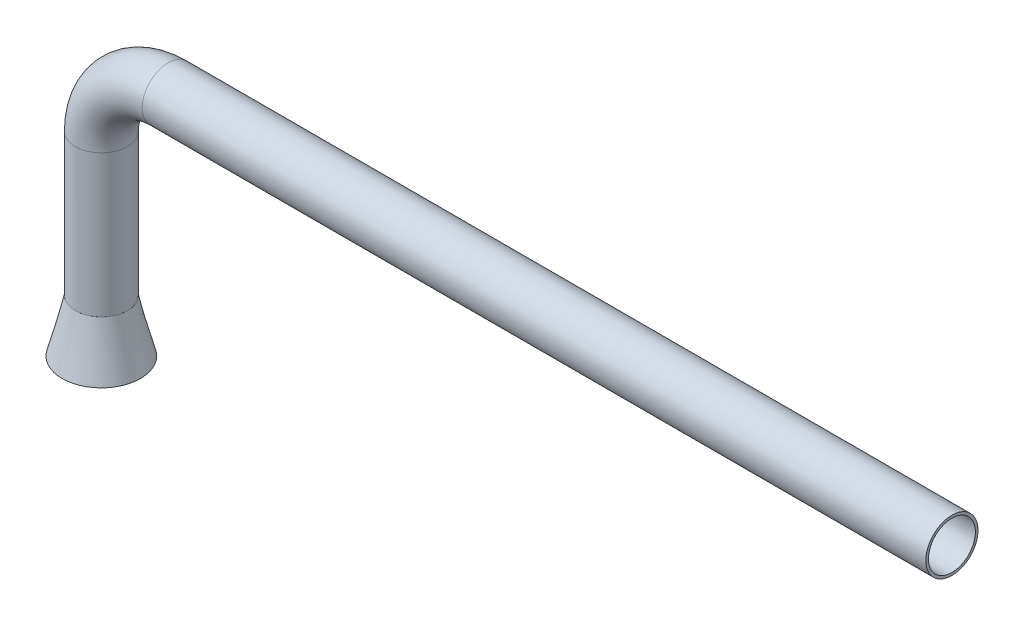
ISO-10303-21;
HEADER;
FILE_DESCRIPTION(('STEP AP214'),'2;1');
FILE_NAME('part.step','',(''),(''),'','','');
FILE_SCHEMA(('AUTOMOTIVE_DESIGN { 1 0 10303 214 1 1 1 1 }'));
ENDSEC;
DATA;
#1=APPLICATION_CONTEXT('core data for automotive mechanical design processes');
#2=APPLICATION_PROTOCOL_DEFINITION('international standard','automotive_design',2000,#1);
#3=PRODUCT_CONTEXT('',#1,'mechanical');
#4=PRODUCT('Part','Part','',(#3));
#5=PRODUCT_RELATED_PRODUCT_CATEGORY('part','',(#4));
#6=PRODUCT_DEFINITION_FORMATION('','',#4);
#7=PRODUCT_DEFINITION_CONTEXT('part definition',#1,'design');
#8=PRODUCT_DEFINITION('design','',#6,#7);
#9=PRODUCT_DEFINITION_SHAPE('','',#8);
#10=(LENGTH_UNIT() NAMED_UNIT(*) SI_UNIT(.MILLI.,.METRE.));
#11=(NAMED_UNIT(*) PLANE_ANGLE_UNIT() SI_UNIT($,.RADIAN.));
#12=(NAMED_UNIT(*) SI_UNIT($,.STERADIAN.) SOLID_ANGLE_UNIT());
#13=UNCERTAINTY_MEASURE_WITH_UNIT(LENGTH_MEASURE(1.E-05),#10,'distance_accuracy_value','');
#14=(GEOMETRIC_REPRESENTATION_CONTEXT(3) GLOBAL_UNCERTAINTY_ASSIGNED_CONTEXT((#13)) GLOBAL_UNIT_ASSIGNED_CONTEXT((#10,
#11,#12)) REPRESENTATION_CONTEXT('',''));
#15=CARTESIAN_POINT('',(0.,0.,0.));
#16=DIRECTION('',(0.,0.,1.));
#17=DIRECTION('',(1.,0.,0.));
#18=AXIS2_PLACEMENT_3D('',#15,#16,#17);
#19=CARTESIAN_POINT('',(6.07472950440457,-9.,2.94281522497023));
#20=CARTESIAN_POINT('',(-1.57129637689256,0.,4.74668596980718));
#21=CARTESIAN_POINT('',(6.45994311655618,-9.,2.14763499232096));
#22=CARTESIAN_POINT('',(-0.949956636407392,0.,4.95236818456793));
#23=CARTESIAN_POINT('',(6.91445651473007,-9.,0.40423462349453));
#24=CARTESIAN_POINT('',(0.374437503861488,0.,5.1168830492816));
#25=CARTESIAN_POINT('',(6.54253067560615,-8.99999999999999,-2.27240894144918));
#26=CARTESIAN_POINT('',(2.30389947098049,0.,4.58389661696968));
#27=CARTESIAN_POINT('',(5.17496444522945,-9.,-4.60307789099868));
#28=CARTESIAN_POINT('',(3.88266351853744,0.,3.35342192042931));
#29=CARTESIAN_POINT('',(3.01952402151656,-8.99999999999999,-6.23312824609515));
#30=CARTESIAN_POINT('',(4.87044664448144,0.,1.61223555688928));
#31=CARTESIAN_POINT('',(0.404432354731002,-9.,-6.91410742923015));
#32=CARTESIAN_POINT('',(5.11666652822928,0.,-0.374302011432238));
#33=CARTESIAN_POINT('',(-2.27234116729204,-9.00000000000002,-6.54260371781042));
#34=CARTESIAN_POINT('',(4.58394273210361,0.,-2.30392035929954));
#35=CARTESIAN_POINT('',(-4.60312331272548,-8.99999999999999,-5.17497241616589));
#36=CARTESIAN_POINT('',(3.35334629236337,0.,-3.88268240519411));
#37=CARTESIAN_POINT('',(-6.23307592550411,-9.00000000000001,-3.01952386829226));
#38=CARTESIAN_POINT('',(1.6122801718573,0.,-4.87049278780115));
#39=CARTESIAN_POINT('',(-6.91415494325105,-8.99999999999999,-0.404407172230821));
#40=CARTESIAN_POINT('',(-0.374297210892632,0.,-5.11664495680803));
#41=CARTESIAN_POINT('',(-6.54260812451881,-9.00000000000002,2.27232847930429));
#42=CARTESIAN_POINT('',(-2.30383844988862,0.,-4.5839838994062));
#43=CARTESIAN_POINT('',(-5.17491952164643,-8.99999999999998,4.60311362199233));
#44=CARTESIAN_POINT('',(-3.88269685150906,0.,-3.35336301586117));
#45=CARTESIAN_POINT('',(-3.01956483010897,-9.00000000000001,6.23310847696026));
#46=CARTESIAN_POINT('',(-4.8704291379254,0.,-1.61228844196252));
#47=CARTESIAN_POINT('',(-0.404376469915538,-9.00000000000001,6.91412053341336));
#48=CARTESIAN_POINT('',(-5.11667492605663,0.,0.374369170286026));
#49=CARTESIAN_POINT('',(2.27223002022386,-8.99999999999999,6.54259281734842));
#50=CARTESIAN_POINT('',(-4.58393962110627,0.,2.30381390687322));
#51=CARTESIAN_POINT('',(4.60317484182041,-9.00000000000001,5.17531601939017));
#52=CARTESIAN_POINT('',(-3.3536009390495,0.,3.88278976071713));
#53=CARTESIAN_POINT('',(5.68951589225296,-9.,3.7379954576195));
#54=CARTESIAN_POINT('',(-2.19263611737772,0.,4.54100375504643));
#55=CARTESIAN_POINT('',(6.07472950440457,-9.,2.94281522497023));
#56=CARTESIAN_POINT('',(-1.57129637689256,0.,4.74668596980718));
#57=B_SPLINE_SURFACE_WITH_KNOTS('',3,1,((#19,#20),(#21,#22),(#23,#24),(#25,#26),(#27,#28),(#29,
#30),(#31,#32),(#33,#34),(#35,#36),(#37,#38),(#39,#40),(#41,#42),(#43,#44),(#45,#46),(#47,#48),
(#49,#50),(#51,#52),(#53,#54),(#55,#56)),.UNSPECIFIED.,.T.,.F.,.F.,(4,1,1,1,1,1,1,1,1,1,1,1,1,1,
1,1,4),(2,2),(0.,0.0625,0.125,0.1875,0.25,0.3125,0.375,0.4375,0.5,0.5625,0.625,0.6875,0.75,
0.8125,0.875,0.9375,1.),(0.,1.),.UNSPECIFIED.);
#58=CARTESIAN_POINT('',(0.,-9.,0.));
#59=DIRECTION('',(0.,1.,0.));
#60=DIRECTION('',(0.,0.,1.));
#61=AXIS2_PLACEMENT_3D('',#58,#59,#60);
#62=CIRCLE('',#61,6.75);
#63=CARTESIAN_POINT('',(6.07472950440457,-9.,2.94281522497023));
#64=VERTEX_POINT('',#63);
#65=EDGE_CURVE('E102',#64,#64,#62,.T.);
#66=CARTESIAN_POINT('',(0.,0.,0.));
#67=DIRECTION('',(0.,-1.,0.));
#68=DIRECTION('',(0.,0.,1.));
#69=AXIS2_PLACEMENT_3D('',#66,#67,#68);
#70=CIRCLE('',#69,5.);
#71=CARTESIAN_POINT('',(-1.57129637689256,0.,4.74668596980718));
#72=VERTEX_POINT('',#71);
#73=EDGE_CURVE('E108',#72,#72,#70,.F.);
#74=CARTESIAN_POINT('',(6.07472950440457,-9.,2.94281522497023));
#75=CARTESIAN_POINT('',(5.99508340147439,-8.90625,2.96160554522895));
#76=CARTESIAN_POINT('',(5.91543729854421,-8.8125,2.98039586548767));
#77=CARTESIAN_POINT('',(5.75614509268386,-8.625,3.0179765060051));
#78=CARTESIAN_POINT('',(5.67649898975368,-8.53125,3.03676682626382));
#79=CARTESIAN_POINT('',(5.51720678389332,-8.34375,3.07434746678126));
#80=CARTESIAN_POINT('',(5.43756068096314,-8.25,3.09313778703997));
#81=CARTESIAN_POINT('',(5.27826847510279,-8.0625,3.13071842755741));
#82=CARTESIAN_POINT('',(5.19862237217261,-7.96875,3.14950874781613));
#83=CARTESIAN_POINT('',(5.03933016631225,-7.78125,3.18708938833357));
#84=CARTESIAN_POINT('',(4.95968406338207,-7.6875,3.20587970859228));
#85=CARTESIAN_POINT('',(4.80039185752172,-7.5,3.24346034910972));
#86=CARTESIAN_POINT('',(4.72074575459154,-7.40625,3.26225066936844));
#87=CARTESIAN_POINT('',(4.56145354873118,-7.21875,3.29983130988588));
#88=CARTESIAN_POINT('',(4.481807445801,-7.125,3.31862163014459));
#89=CARTESIAN_POINT('',(4.32251523994065,-6.9375,3.35620227066203));
#90=CARTESIAN_POINT('',(4.24286913701047,-6.84375,3.37499259092075));
#91=CARTESIAN_POINT('',(4.08357693115011,-6.65625,3.41257323143819));
#92=CARTESIAN_POINT('',(4.00393082821993,-6.5625,3.4313635516969));
#93=CARTESIAN_POINT('',(3.84463862235958,-6.375,3.46894419221434));
#94=CARTESIAN_POINT('',(3.7649925194294,-6.28125,3.48773451247306));
#95=CARTESIAN_POINT('',(3.60570031356904,-6.09375,3.52531515299049));
#96=CARTESIAN_POINT('',(3.52605421063886,-6.,3.54410547324921));
#97=CARTESIAN_POINT('',(3.36676200477851,-5.8125,3.58168611376665));
#98=CARTESIAN_POINT('',(3.28711590184833,-5.71875,3.60047643402537));
#99=CARTESIAN_POINT('',(3.12782369598797,-5.53125,3.6380570745428));
#100=CARTESIAN_POINT('',(3.04817759305779,-5.4375,3.65684739480152));
#101=CARTESIAN_POINT('',(2.88888538719743,-5.25,3.69442803531896));
#102=CARTESIAN_POINT('',(2.80923928426726,-5.15625,3.71321835557768));
#103=CARTESIAN_POINT('',(2.6499470784069,-4.96875,3.75079899609511));
#104=CARTESIAN_POINT('',(2.57030097547672,-4.875,3.76958931635383));
#105=CARTESIAN_POINT('',(2.41100876961636,-4.6875,3.80716995687127));
#106=CARTESIAN_POINT('',(2.33136266668619,-4.59375,3.82596027712999));
#107=CARTESIAN_POINT('',(2.17207046082583,-4.40625,3.86354091764742));
#108=CARTESIAN_POINT('',(2.09242435789565,-4.3125,3.88233123790614));
#109=CARTESIAN_POINT('',(1.93313215203529,-4.125,3.91991187842358));
#110=CARTESIAN_POINT('',(1.85348604910512,-4.03125,3.9387021986823));
#111=CARTESIAN_POINT('',(1.69419384324476,-3.84375,3.97628283919973));
#112=CARTESIAN_POINT('',(1.61454774031458,-3.75,3.99507315945845));
#113=CARTESIAN_POINT('',(1.45525553445422,-3.5625,4.03265379997589));
#114=CARTESIAN_POINT('',(1.37560943152404,-3.46875,4.0514441202346));
#115=CARTESIAN_POINT('',(1.21631722566369,-3.28125,4.08902476075204));
#116=CARTESIAN_POINT('',(1.13667112273351,-3.1875,4.10781508101076));
#117=CARTESIAN_POINT('',(0.977378916873153,-3.,4.1453957215282));
#118=CARTESIAN_POINT('',(0.897732813942974,-2.90625,4.16418604178691));
#119=CARTESIAN_POINT('',(0.738440608082617,-2.71875,4.20176668230435));
#120=CARTESIAN_POINT('',(0.658794505152439,-2.625,4.22055700256307));
#121=CARTESIAN_POINT('',(0.499502299292082,-2.4375,4.25813764308051));
#122=CARTESIAN_POINT('',(0.419856196361903,-2.34375,4.27692796333922));
#123=CARTESIAN_POINT('',(0.260563990501547,-2.15625,4.31450860385666));
#124=CARTESIAN_POINT('',(0.180917887571368,-2.0625,4.33329892411538));
#125=CARTESIAN_POINT('',(0.0216256817110114,-1.875,4.37087956463281));
#126=CARTESIAN_POINT('',(-0.0580204212191671,-1.78125,4.38966988489153));
#127=CARTESIAN_POINT('',(-0.217312627079524,-1.59375,4.42725052540897));
#128=CARTESIAN_POINT('',(-0.296958730009702,-1.5,4.44604084566769));
#129=CARTESIAN_POINT('',(-0.456250935870059,-1.3125,4.48362148618512));
#130=CARTESIAN_POINT('',(-0.535897038800238,-1.21875,4.50241180644384));
#131=CARTESIAN_POINT('',(-0.695189244660595,-1.03125,4.53999244696128));
#132=CARTESIAN_POINT('',(-0.774835347590773,-0.9375,4.55878276722));
#133=CARTESIAN_POINT('',(-0.93412755345113,-0.75,4.59636340773743));
#134=CARTESIAN_POINT('',(-1.01377365638131,-0.65625,4.61515372799615));
#135=CARTESIAN_POINT('',(-1.17306586224166,-0.46875,4.65273436851359));
#136=CARTESIAN_POINT('',(-1.25271196517184,-0.375,4.67152468877231));
#137=CARTESIAN_POINT('',(-1.4120041710322,-0.1875,4.70910532928974));
#138=CARTESIAN_POINT('',(-1.49165027396238,-0.09375,4.72789564954846));
#139=CARTESIAN_POINT('',(-1.57129637689256,0.,4.74668596980718));
#140=B_SPLINE_CURVE_WITH_KNOTS('',3,(#74,#75,#76,#77,#78,#79,#80,#81,#82,#83,#84,#85,#86,#87,
#88,#89,#90,#91,#92,#93,#94,#95,#96,#97,#98,#99,#100,#101,#102,#103,#104,#105,#106,#107,#108,
#109,#110,#111,#112,#113,#114,#115,#116,#117,#118,#119,#120,#121,#122,#123,#124,#125,#126,#127,
#128,#129,#130,#131,#132,#133,#134,#135,#136,#137,#138,#139),.UNSPECIFIED.,.F.,.F.,(4,2,2,2,2,2,
2,2,2,2,2,2,2,2,2,2,2,2,2,2,2,2,2,2,2,2,2,2,2,2,2,2,4),(0.,0.37332393859289,0.746647877185781,
1.11997181577867,1.49329575437156,1.86661969296445,2.23994363155734,2.61326757015023,
2.98659150874312,3.35991544733601,3.7332393859289,4.10656332452179,4.47988726311468,
4.85321120170757,5.22653514030046,5.59985907889335,5.97318301748624,6.34650695607913,
6.71983089467202,7.09315483326491,7.4664787718578,7.83980271045069,8.21312664904358,
8.58645058763647,8.95977452622936,9.33309846482225,9.70642240341514,10.079746342008,
10.4530702806009,10.8263942191938,11.1997181577867,11.5730420963796,11.9463660349725),.UNSPECIFIED.);
#141=EDGE_CURVE('BSEAM92',#64,#72,#140,.T.);
#142=ORIENTED_EDGE('',*,*,#65,.F.);
#143=ORIENTED_EDGE('',*,*,#73,.T.);
#144=ORIENTED_EDGE('',*,*,#141,.T.);
#145=ORIENTED_EDGE('',*,*,#141,.F.);
#146=EDGE_LOOP('',(#142,#144,#143,#145));
#147=FACE_BOUND('',#146,.T.);
#148=ADVANCED_FACE('F92',(#147),#57,.F.);
#149=CARTESIAN_POINT('',(0.,-9.,0.));
#150=DIRECTION('',(0.,1.,0.));
#151=DIRECTION('',(0.,0.,1.));
#152=AXIS2_PLACEMENT_3D('',#149,#150,#151);
#153=PLANE('',#152);
#154=CARTESIAN_POINT('',(-5.39665078647604,-9.,-1.06120699622062));
#155=DIRECTION('',(0.,1.,0.));
#156=DIRECTION('',(0.,0.,1.));
#157=AXIS2_PLACEMENT_3D('',#154,#155,#156);
#158=CIRCLE('',#157,1.);
#159=CARTESIAN_POINT('',(-5.39665078647604,-9.,-0.0612069962206204));
#160=VERTEX_POINT('',#159);
#161=EDGE_CURVE('E156',#160,#160,#158,.F.);
#162=ORIENTED_EDGE('',*,*,#161,.T.);
#163=EDGE_LOOP('',(#162));
#164=FACE_BOUND('',#163,.T.);
#165=CARTESIAN_POINT('',(-0.0332892665441764,-9.,2.99981529843638));
#166=DIRECTION('',(0.,1.,0.));
#167=DIRECTION('',(0.,0.,1.));
#168=AXIS2_PLACEMENT_3D('',#165,#166,#167);
#169=CIRCLE('',#168,1.);
#170=CARTESIAN_POINT('',(-0.0332892665441764,-9.,3.99981529843638));
#171=VERTEX_POINT('',#170);
#172=EDGE_CURVE('E203',#171,#171,#169,.F.);
#173=ORIENTED_EDGE('',*,*,#172,.T.);
#174=EDGE_LOOP('',(#173));
#175=FACE_BOUND('',#174,.T.);
#176=CARTESIAN_POINT('',(2.58127162183502,-9.,1.52873699971879));
#177=DIRECTION('',(0.,1.,0.));
#178=DIRECTION('',(0.,0.,1.));
#179=AXIS2_PLACEMENT_3D('',#176,#177,#178);
#180=CIRCLE('',#179,1.);
#181=CARTESIAN_POINT('',(2.58127162183502,-9.,2.52873699971879));
#182=VERTEX_POINT('',#181);
#183=EDGE_CURVE('E207',#182,#182,#180,.F.);
#184=ORIENTED_EDGE('',*,*,#183,.T.);
#185=EDGE_LOOP('',(#184));
#186=FACE_BOUND('',#185,.T.);
#187=CARTESIAN_POINT('',(2.61456088837918,-9.,-1.47107829871759));
#188=DIRECTION('',(0.,1.,0.));
#189=DIRECTION('',(0.,0.,1.));
#190=AXIS2_PLACEMENT_3D('',#187,#188,#189);
#191=CIRCLE('',#190,1.);
#192=CARTESIAN_POINT('',(2.61456088837918,-9.,-0.471078298717594));
#193=VERTEX_POINT('',#192);
#194=EDGE_CURVE('E211',#193,#193,#191,.F.);
#195=ORIENTED_EDGE('',*,*,#194,.T.);
#196=EDGE_LOOP('',(#195));
#197=FACE_BOUND('',#196,.T.);
#198=CARTESIAN_POINT('',(0.0332892665441554,-9.,-2.99981529843638));
#199=DIRECTION('',(0.,1.,0.));
#200=DIRECTION('',(0.,0.,1.));
#201=AXIS2_PLACEMENT_3D('',#198,#199,#200);
#202=CIRCLE('',#201,1.);
#203=CARTESIAN_POINT('',(0.0332892665441554,-9.,-1.99981529843638));
#204=VERTEX_POINT('',#203);
#205=EDGE_CURVE('E215',#204,#204,#202,.F.);
#206=ORIENTED_EDGE('',*,*,#205,.T.);
#207=EDGE_LOOP('',(#206));
#208=FACE_BOUND('',#207,.T.);
#209=CARTESIAN_POINT('',(-2.58127162183503,-9.,-1.52873699971877));
#210=DIRECTION('',(0.,1.,0.));
#211=DIRECTION('',(0.,0.,1.));
#212=AXIS2_PLACEMENT_3D('',#209,#210,#211);
#213=CIRCLE('',#212,1.);
#214=CARTESIAN_POINT('',(-2.58127162183503,-9.,-0.528736999718774));
#215=VERTEX_POINT('',#214);
#216=EDGE_CURVE('E219',#215,#215,#213,.F.);
#217=ORIENTED_EDGE('',*,*,#216,.T.);
#218=EDGE_LOOP('',(#217));
#219=FACE_BOUND('',#218,.T.);
#220=CARTESIAN_POINT('',(-4.98974402097411,-9.,2.31353724957112));
#221=DIRECTION('',(0.,1.,0.));
#222=DIRECTION('',(0.,0.,1.));
#223=AXIS2_PLACEMENT_3D('',#220,#221,#222);
#224=CIRCLE('',#223,1.);
#225=CARTESIAN_POINT('',(-4.98974402097411,-9.,3.31353724957112));
#226=VERTEX_POINT('',#225);
#227=EDGE_CURVE('E223',#226,#226,#224,.F.);
#228=ORIENTED_EDGE('',*,*,#227,.T.);
#229=EDGE_LOOP('',(#228));
#230=FACE_BOUND('',#229,.T.);
#231=CARTESIAN_POINT('',(-2.61456088837917,-9.,1.47107829871761));
#232=DIRECTION('',(0.,1.,0.));
#233=DIRECTION('',(0.,0.,1.));
#234=AXIS2_PLACEMENT_3D('',#231,#232,#233);
#235=CIRCLE('',#234,1.);
#236=CARTESIAN_POINT('',(-2.61456088837917,-9.,2.47107829871761));
#237=VERTEX_POINT('',#236);
#238=EDGE_CURVE('E227',#237,#237,#235,.F.);
#239=ORIENTED_EDGE('',*,*,#238,.T.);
#240=EDGE_LOOP('',(#239));
#241=FACE_BOUND('',#240,.T.);
#242=CARTESIAN_POINT('',(-3.74222037695796,-9.,-4.03060623855527));
#243=DIRECTION('',(0.,1.,0.));
#244=DIRECTION('',(0.,0.,1.));
#245=AXIS2_PLACEMENT_3D('',#242,#243,#244);
#246=CIRCLE('',#245,1.);
#247=CARTESIAN_POINT('',(-3.74222037695796,-9.,-3.03060623855527));
#248=VERTEX_POINT('',#247);
#249=EDGE_CURVE('E231',#248,#248,#246,.F.);
#250=ORIENTED_EDGE('',*,*,#249,.T.);
#251=EDGE_LOOP('',(#250));
#252=FACE_BOUND('',#251,.T.);
#253=CARTESIAN_POINT('',(-0.658388976834377,-9.,-5.46045089302916));
#254=DIRECTION('',(0.,1.,0.));
#255=DIRECTION('',(0.,0.,1.));
#256=AXIS2_PLACEMENT_3D('',#253,#254,#255);
#257=CIRCLE('',#256,1.);
#258=CARTESIAN_POINT('',(-0.658388976834377,-9.,-4.46045089302916));
#259=VERTEX_POINT('',#258);
#260=EDGE_CURVE('E235',#259,#259,#257,.F.);
#261=ORIENTED_EDGE('',*,*,#260,.T.);
#262=EDGE_LOOP('',(#261));
#263=FACE_BOUND('',#262,.T.);
#264=CARTESIAN_POINT('',(2.67692463462167,-9.,-4.80458890026563));
#265=DIRECTION('',(0.,1.,0.));
#266=DIRECTION('',(0.,0.,1.));
#267=AXIS2_PLACEMENT_3D('',#264,#265,#266);
#268=CIRCLE('',#267,1.);
#269=CARTESIAN_POINT('',(2.67692463462167,-9.,-3.80458890026563));
#270=VERTEX_POINT('',#269);
#271=EDGE_CURVE('E239',#270,#270,#268,.F.);
#272=ORIENTED_EDGE('',*,*,#271,.T.);
#273=EDGE_LOOP('',(#272));
#274=FACE_BOUND('',#273,.T.);
#275=CARTESIAN_POINT('',(4.98974402097413,-9.,-2.31353724957109));
#276=DIRECTION('',(0.,1.,0.));
#277=DIRECTION('',(0.,0.,1.));
#278=AXIS2_PLACEMENT_3D('',#275,#276,#277);
#279=CIRCLE('',#278,1.);
#280=CARTESIAN_POINT('',(4.98974402097413,-9.,-1.31353724957109));
#281=VERTEX_POINT('',#280);
#282=EDGE_CURVE('E243',#281,#281,#279,.F.);
#283=ORIENTED_EDGE('',*,*,#282,.T.);
#284=EDGE_LOOP('',(#283));
#285=FACE_BOUND('',#284,.T.);
#286=CARTESIAN_POINT('',(5.39665078647603,-9.,1.06120699622066));
#287=DIRECTION('',(0.,1.,0.));
#288=DIRECTION('',(0.,0.,1.));
#289=AXIS2_PLACEMENT_3D('',#286,#287,#288);
#290=CIRCLE('',#289,0.999999999999999);
#291=CARTESIAN_POINT('',(5.39665078647603,-9.,2.06120699622066));
#292=VERTEX_POINT('',#291);
#293=EDGE_CURVE('E247',#292,#292,#290,.F.);
#294=ORIENTED_EDGE('',*,*,#293,.T.);
#295=EDGE_LOOP('',(#294));
#296=FACE_BOUND('',#295,.T.);
#297=CARTESIAN_POINT('',(3.74222037695793,-9.,4.03060623855529));
#298=DIRECTION('',(0.,1.,0.));
#299=DIRECTION('',(0.,0.,1.));
#300=AXIS2_PLACEMENT_3D('',#297,#298,#299);
#301=CIRCLE('',#300,0.999999999999999);
#302=CARTESIAN_POINT('',(3.74222037695793,-9.,5.03060623855529));
#303=VERTEX_POINT('',#302);
#304=EDGE_CURVE('E251',#303,#303,#301,.F.);
#305=ORIENTED_EDGE('',*,*,#304,.T.);
#306=EDGE_LOOP('',(#305));
#307=FACE_BOUND('',#306,.T.);
#308=CARTESIAN_POINT('',(0.658388976834339,-9.,5.46045089302917));
#309=DIRECTION('',(0.,1.,0.));
#310=DIRECTION('',(0.,0.,1.));
#311=AXIS2_PLACEMENT_3D('',#308,#309,#310);
#312=CIRCLE('',#311,1.);
#313=CARTESIAN_POINT('',(0.658388976834339,-9.,6.46045089302917));
#314=VERTEX_POINT('',#313);
#315=EDGE_CURVE('E255',#314,#314,#312,.F.);
#316=ORIENTED_EDGE('',*,*,#315,.T.);
#317=EDGE_LOOP('',(#316));
#318=FACE_BOUND('',#317,.T.);
#319=CARTESIAN_POINT('',(-2.6769246346217,-9.,4.8045889002656));
#320=DIRECTION('',(0.,1.,0.));
#321=DIRECTION('',(0.,0.,1.));
#322=AXIS2_PLACEMENT_3D('',#319,#320,#321);
#323=CIRCLE('',#322,0.999999999999999);
#324=CARTESIAN_POINT('',(-2.6769246346217,-9.,5.8045889002656));
#325=VERTEX_POINT('',#324);
#326=EDGE_CURVE('E259',#325,#325,#323,.F.);
#327=ORIENTED_EDGE('',*,*,#326,.T.);
#328=EDGE_LOOP('',(#327));
#329=FACE_BOUND('',#328,.T.);
#330=CARTESIAN_POINT('',(0.,-9.,0.));
#331=DIRECTION('',(0.,1.,0.));
#332=DIRECTION('',(0.,0.,1.));
#333=AXIS2_PLACEMENT_3D('',#330,#331,#332);
#334=CIRCLE('',#333,1.);
#335=CARTESIAN_POINT('',(0.,-9.,1.));
#336=VERTEX_POINT('',#335);
#337=EDGE_CURVE('E262',#336,#336,#334,.F.);
#338=ORIENTED_EDGE('',*,*,#337,.T.);
#339=EDGE_LOOP('',(#338));
#340=FACE_BOUND('',#339,.T.);
#341=ORIENTED_EDGE('',*,*,#65,.T.);
#342=EDGE_LOOP('',(#341));
#343=FACE_BOUND('',#342,.T.);
#344=ADVANCED_FACE('F135',(#164,#175,#186,#197,#208,#219,#230,#241,#252,#263,#274,#285,#296,
#307,#318,#329,#340,#343),#153,.T.);
#345=CARTESIAN_POINT('',(0.,-10.,0.));
#346=DIRECTION('',(0.,-1.,0.));
#347=DIRECTION('',(0.,0.,-1.));
#348=AXIS2_PLACEMENT_3D('',#345,#346,#347);
#349=PLANE('',#348);
#350=CARTESIAN_POINT('',(-5.39665078647604,-10.,-1.06120699622062));
#351=DIRECTION('',(0.,1.,0.));
#352=DIRECTION('',(0.,0.,1.));
#353=AXIS2_PLACEMENT_3D('',#350,#351,#352);
#354=CIRCLE('',#353,1.);
#355=CARTESIAN_POINT('',(-5.39665078647604,-10.,-0.0612069962206204));
#356=VERTEX_POINT('',#355);
#357=EDGE_CURVE('E297',#356,#356,#354,.T.);
#358=ORIENTED_EDGE('',*,*,#357,.T.);
#359=EDGE_LOOP('',(#358));
#360=FACE_BOUND('',#359,.T.);
#361=CARTESIAN_POINT('',(-0.0332892665441764,-10.,2.99981529843638));
#362=DIRECTION('',(0.,1.,0.));
#363=DIRECTION('',(0.,0.,1.));
#364=AXIS2_PLACEMENT_3D('',#361,#362,#363);
#365=CIRCLE('',#364,1.);
#366=CARTESIAN_POINT('',(-0.0332892665441764,-10.,3.99981529843638));
#367=VERTEX_POINT('',#366);
#368=EDGE_CURVE('E300',#367,#367,#365,.T.);
#369=ORIENTED_EDGE('',*,*,#368,.T.);
#370=EDGE_LOOP('',(#369));
#371=FACE_BOUND('',#370,.T.);
#372=CARTESIAN_POINT('',(2.58127162183502,-10.,1.52873699971879));
#373=DIRECTION('',(0.,1.,0.));
#374=DIRECTION('',(0.,0.,1.));
#375=AXIS2_PLACEMENT_3D('',#372,#373,#374);
#376=CIRCLE('',#375,1.);
#377=CARTESIAN_POINT('',(2.58127162183502,-10.,2.52873699971879));
#378=VERTEX_POINT('',#377);
#379=EDGE_CURVE('E304',#378,#378,#376,.T.);
#380=ORIENTED_EDGE('',*,*,#379,.T.);
#381=EDGE_LOOP('',(#380));
#382=FACE_BOUND('',#381,.T.);
#383=CARTESIAN_POINT('',(2.61456088837918,-10.,-1.47107829871759));
#384=DIRECTION('',(0.,1.,0.));
#385=DIRECTION('',(0.,0.,1.));
#386=AXIS2_PLACEMENT_3D('',#383,#384,#385);
#387=CIRCLE('',#386,1.);
#388=CARTESIAN_POINT('',(2.61456088837918,-10.,-0.471078298717594));
#389=VERTEX_POINT('',#388);
#390=EDGE_CURVE('E289',#389,#389,#387,.T.);
#391=ORIENTED_EDGE('',*,*,#390,.T.);
#392=EDGE_LOOP('',(#391));
#393=FACE_BOUND('',#392,.T.);
#394=CARTESIAN_POINT('',(0.0332892665441554,-10.,-2.99981529843638));
#395=DIRECTION('',(0.,1.,0.));
#396=DIRECTION('',(0.,0.,1.));
#397=AXIS2_PLACEMENT_3D('',#394,#395,#396);
#398=CIRCLE('',#397,1.);
#399=CARTESIAN_POINT('',(0.0332892665441554,-10.,-1.99981529843638));
#400=VERTEX_POINT('',#399);
#401=EDGE_CURVE('E285',#400,#400,#398,.T.);
#402=ORIENTED_EDGE('',*,*,#401,.T.);
#403=EDGE_LOOP('',(#402));
#404=FACE_BOUND('',#403,.T.);
#405=CARTESIAN_POINT('',(-2.58127162183503,-10.,-1.52873699971877));
#406=DIRECTION('',(0.,1.,0.));
#407=DIRECTION('',(0.,0.,1.));
#408=AXIS2_PLACEMENT_3D('',#405,#406,#407);
#409=CIRCLE('',#408,1.);
#410=CARTESIAN_POINT('',(-2.58127162183503,-10.,-0.528736999718774));
#411=VERTEX_POINT('',#410);
#412=EDGE_CURVE('E288',#411,#411,#409,.T.);
#413=ORIENTED_EDGE('',*,*,#412,.T.);
#414=EDGE_LOOP('',(#413));
#415=FACE_BOUND('',#414,.T.);
#416=CARTESIAN_POINT('',(-4.98974402097411,-10.,2.31353724957112));
#417=DIRECTION('',(0.,1.,0.));
#418=DIRECTION('',(0.,0.,1.));
#419=AXIS2_PLACEMENT_3D('',#416,#417,#418);
#420=CIRCLE('',#419,1.);
#421=CARTESIAN_POINT('',(-4.98974402097411,-10.,3.31353724957112));
#422=VERTEX_POINT('',#421);
#423=EDGE_CURVE('E292',#422,#422,#420,.T.);
#424=ORIENTED_EDGE('',*,*,#423,.T.);
#425=EDGE_LOOP('',(#424));
#426=FACE_BOUND('',#425,.T.);
#427=CARTESIAN_POINT('',(-2.61456088837917,-10.,1.47107829871761));
#428=DIRECTION('',(0.,1.,0.));
#429=DIRECTION('',(0.,0.,1.));
#430=AXIS2_PLACEMENT_3D('',#427,#428,#429);
#431=CIRCLE('',#430,1.);
#432=CARTESIAN_POINT('',(-2.61456088837917,-10.,2.47107829871761));
#433=VERTEX_POINT('',#432);
#434=EDGE_CURVE('E268',#433,#433,#431,.T.);
#435=ORIENTED_EDGE('',*,*,#434,.T.);
#436=EDGE_LOOP('',(#435));
#437=FACE_BOUND('',#436,.T.);
#438=CARTESIAN_POINT('',(-3.74222037695796,-10.,-4.03060623855527));
#439=DIRECTION('',(0.,1.,0.));
#440=DIRECTION('',(0.,0.,1.));
#441=AXIS2_PLACEMENT_3D('',#438,#439,#440);
#442=CIRCLE('',#441,1.);
#443=CARTESIAN_POINT('',(-3.74222037695796,-10.,-3.03060623855527));
#444=VERTEX_POINT('',#443);
#445=EDGE_CURVE('E301',#444,#444,#442,.T.);
#446=ORIENTED_EDGE('',*,*,#445,.T.);
#447=EDGE_LOOP('',(#446));
#448=FACE_BOUND('',#447,.T.);
#449=CARTESIAN_POINT('',(-0.658388976834377,-10.,-5.46045089302916));
#450=DIRECTION('',(0.,1.,0.));
#451=DIRECTION('',(0.,0.,1.));
#452=AXIS2_PLACEMENT_3D('',#449,#450,#451);
#453=CIRCLE('',#452,1.);
#454=CARTESIAN_POINT('',(-0.658388976834377,-10.,-4.46045089302916));
#455=VERTEX_POINT('',#454);
#456=EDGE_CURVE('E327',#455,#455,#453,.T.);
#457=ORIENTED_EDGE('',*,*,#456,.T.);
#458=EDGE_LOOP('',(#457));
#459=FACE_BOUND('',#458,.T.);
#460=CARTESIAN_POINT('',(2.67692463462167,-10.,-4.80458890026563));
#461=DIRECTION('',(0.,1.,0.));
#462=DIRECTION('',(0.,0.,1.));
#463=AXIS2_PLACEMENT_3D('',#460,#461,#462);
#464=CIRCLE('',#463,1.);
#465=CARTESIAN_POINT('',(2.67692463462167,-10.,-3.80458890026563));
#466=VERTEX_POINT('',#465);
#467=EDGE_CURVE('E324',#466,#466,#464,.T.);
#468=ORIENTED_EDGE('',*,*,#467,.T.);
#469=EDGE_LOOP('',(#468));
#470=FACE_BOUND('',#469,.T.);
#471=CARTESIAN_POINT('',(4.98974402097413,-10.,-2.31353724957109));
#472=DIRECTION('',(0.,1.,0.));
#473=DIRECTION('',(0.,0.,1.));
#474=AXIS2_PLACEMENT_3D('',#471,#472,#473);
#475=CIRCLE('',#474,1.);
#476=CARTESIAN_POINT('',(4.98974402097413,-10.,-1.31353724957109));
#477=VERTEX_POINT('',#476);
#478=EDGE_CURVE('E321',#477,#477,#475,.T.);
#479=ORIENTED_EDGE('',*,*,#478,.T.);
#480=EDGE_LOOP('',(#479));
#481=FACE_BOUND('',#480,.T.);
#482=CARTESIAN_POINT('',(5.39665078647603,-10.,1.06120699622066));
#483=DIRECTION('',(0.,1.,0.));
#484=DIRECTION('',(0.,0.,1.));
#485=AXIS2_PLACEMENT_3D('',#482,#483,#484);
#486=CIRCLE('',#485,0.999999999999999);
#487=CARTESIAN_POINT('',(5.39665078647603,-10.,2.06120699622066));
#488=VERTEX_POINT('',#487);
#489=EDGE_CURVE('E318',#488,#488,#486,.T.);
#490=ORIENTED_EDGE('',*,*,#489,.T.);
#491=EDGE_LOOP('',(#490));
#492=FACE_BOUND('',#491,.T.);
#493=CARTESIAN_POINT('',(3.74222037695793,-10.,4.03060623855529));
#494=DIRECTION('',(0.,1.,0.));
#495=DIRECTION('',(0.,0.,1.));
#496=AXIS2_PLACEMENT_3D('',#493,#494,#495);
#497=CIRCLE('',#496,0.999999999999999);
#498=CARTESIAN_POINT('',(3.74222037695793,-10.,5.03060623855529));
#499=VERTEX_POINT('',#498);
#500=EDGE_CURVE('E315',#499,#499,#497,.T.);
#501=ORIENTED_EDGE('',*,*,#500,.T.);
#502=EDGE_LOOP('',(#501));
#503=FACE_BOUND('',#502,.T.);
#504=CARTESIAN_POINT('',(0.658388976834339,-10.,5.46045089302917));
#505=DIRECTION('',(0.,1.,0.));
#506=DIRECTION('',(0.,0.,1.));
#507=AXIS2_PLACEMENT_3D('',#504,#505,#506);
#508=CIRCLE('',#507,1.);
#509=CARTESIAN_POINT('',(0.658388976834339,-10.,6.46045089302917));
#510=VERTEX_POINT('',#509);
#511=EDGE_CURVE('E312',#510,#510,#508,.T.);
#512=ORIENTED_EDGE('',*,*,#511,.T.);
#513=EDGE_LOOP('',(#512));
#514=FACE_BOUND('',#513,.T.);
#515=CARTESIAN_POINT('',(-2.6769246346217,-10.,4.8045889002656));
#516=DIRECTION('',(0.,1.,0.));
#517=DIRECTION('',(0.,0.,1.));
#518=AXIS2_PLACEMENT_3D('',#515,#516,#517);
#519=CIRCLE('',#518,0.999999999999999);
#520=CARTESIAN_POINT('',(-2.6769246346217,-10.,5.8045889002656));
#521=VERTEX_POINT('',#520);
#522=EDGE_CURVE('E309',#521,#521,#519,.T.);
#523=ORIENTED_EDGE('',*,*,#522,.T.);
#524=EDGE_LOOP('',(#523));
#525=FACE_BOUND('',#524,.T.);
#526=CARTESIAN_POINT('',(0.,-10.,0.));
#527=DIRECTION('',(0.,1.,0.));
#528=DIRECTION('',(0.,0.,1.));
#529=AXIS2_PLACEMENT_3D('',#526,#527,#528);
#530=CIRCLE('',#529,1.);
#531=CARTESIAN_POINT('',(0.,-10.,1.));
#532=VERTEX_POINT('',#531);
#533=EDGE_CURVE('E264',#532,#532,#530,.T.);
#534=ORIENTED_EDGE('',*,*,#533,.T.);
#535=EDGE_LOOP('',(#534));
#536=FACE_BOUND('',#535,.T.);
#537=CARTESIAN_POINT('',(0.,-10.,0.));
#538=DIRECTION('',(0.,1.,0.));
#539=DIRECTION('',(0.,0.,1.));
#540=AXIS2_PLACEMENT_3D('',#537,#538,#539);
#541=CIRCLE('',#540,7.5);
#542=CARTESIAN_POINT('',(0.,-10.,7.5));
#543=VERTEX_POINT('',#542);
#544=EDGE_CURVE('E12',#543,#543,#541,.F.);
#545=ORIENTED_EDGE('',*,*,#544,.T.);
#546=EDGE_LOOP('',(#545));
#547=FACE_BOUND('',#546,.T.);
#548=ADVANCED_FACE('F131',(#360,#371,#382,#393,#404,#415,#426,#437,#448,#459,#470,#481,#492,
#503,#514,#525,#536,#547),#349,.T.);
#549=CARTESIAN_POINT('',(-1.26691817363422,0.,4.83682936863761));
#550=CARTESIAN_POINT('',(0.530973572613423,-10.,7.48118086034458));
#551=CARTESIAN_POINT('',(-1.90005765743336,0.,4.67099016751309));
#552=CARTESIAN_POINT('',(-0.44831071201304,-10.,7.55068513846844));
#553=CARTESIAN_POINT('',(-3.10045103626549,0.,4.08777432792513));
#554=CARTESIAN_POINT('',(-2.43449362418448,-10.,7.30061991709625));
#555=CARTESIAN_POINT('',(-4.42850741673895,0.,2.59005463790599));
#556=CARTESIAN_POINT('',(-5.04277079846758,-10.,5.81305676834324));
#557=CARTESIAN_POINT('',(-5.08260616716353,0.,0.698304463761018));
#558=CARTESIAN_POINT('',(-6.88336587085297,-10.,3.44092182966559));
#559=CARTESIAN_POINT('',(-4.96292438126572,0.,-1.29997522802434));
#560=CARTESIAN_POINT('',(-7.67623274238759,-10.,0.544790466251172));
#561=CARTESIAN_POINT('',(-4.08766650803297,0.,-3.10021948835393));
#562=CARTESIAN_POINT('',(-7.30036481282834,-9.99999999999999,-2.43417222814991));
#563=CARTESIAN_POINT('',(-2.59008194123295,0.,-4.42855004836792));
#564=CARTESIAN_POINT('',(-5.81320750189516,-10.,-5.04267223559041));
#565=CARTESIAN_POINT('',(-0.698230747633061,0.,-5.08258082465697));
#566=CARTESIAN_POINT('',(-3.44087057963428,-9.99999999999999,-6.88339964167748));
#567=CARTESIAN_POINT('',(1.29996293554475,0.,-4.96298737806144));
#568=CARTESIAN_POINT('',(-0.544815169261785,-9.99999999999997,-7.67620278471777));
#569=CARTESIAN_POINT('',(3.10020371528387,0.,-4.0876510296075));
#570=CARTESIAN_POINT('',(2.43418302936883,-10.,-7.30037902799375));
#571=CARTESIAN_POINT('',(4.42850376629445,0.,-2.59016107319915));
#572=CARTESIAN_POINT('',(5.04271901780169,-9.99999999999996,-5.81316692029274));
#573=CARTESIAN_POINT('',(5.0826020479736,0.,-0.698236907359247));
#574=CARTESIAN_POINT('',(6.88338709454781,-10.,-3.44085787897307));
#575=CARTESIAN_POINT('',(4.96293849660025,0.,1.29992133862086));
#576=CARTESIAN_POINT('',(7.67622895308792,-10.,-0.544843855793798));
#577=CARTESIAN_POINT('',(4.08763698016024,0.,3.10028038942026));
#578=CARTESIAN_POINT('',(7.3003528341323,-10.,2.43423853536773));
#579=CARTESIAN_POINT('',(2.59013730064242,0.,4.42845906961676));
#580=CARTESIAN_POINT('',(5.81324320589288,-10.,5.04255587445479));
#581=CARTESIAN_POINT('',(0.698385866529329,0.,5.08280953467229));
#582=CARTESIAN_POINT('',(3.44121208357429,-10.,6.88359424835309));
#583=CARTESIAN_POINT('',(-0.633778689835082,0.,5.00266856976214));
#584=CARTESIAN_POINT('',(1.51025785723989,-10.,7.41167658222072));
#585=CARTESIAN_POINT('',(-1.26691817363422,0.,4.83682936863761));
#586=CARTESIAN_POINT('',(0.530973572613423,-10.,7.48118086034458));
#587=B_SPLINE_SURFACE_WITH_KNOTS('',3,1,((#549,#550),(#551,#552),(#553,#554),(#555,#556),(#557,
#558),(#559,#560),(#561,#562),(#563,#564),(#565,#566),(#567,#568),(#569,#570),(#571,#572),(#573,
#574),(#575,#576),(#577,#578),(#579,#580),(#581,#582),(#583,#584),(#585,#586)),.UNSPECIFIED.,
.T.,.F.,.F.,(4,1,1,1,1,1,1,1,1,1,1,1,1,1,1,1,4),(2,2),(0.,0.0625,0.125,0.1875,0.25,0.3125,0.375,
0.4375,0.5,0.5625,0.625,0.6875,0.75,0.8125,0.875,0.9375,1.),(0.,1.),.UNSPECIFIED.);
#588=ORIENTED_EDGE('',*,*,#73,.F.);
#589=EDGE_LOOP('',(#588));
#590=FACE_BOUND('',#589,.T.);
#591=ORIENTED_EDGE('',*,*,#544,.F.);
#592=EDGE_LOOP('',(#591));
#593=FACE_BOUND('',#592,.T.);
#594=ADVANCED_FACE('F119',(#590,#593),#587,.T.);
#595=CARTESIAN_POINT('',(0.,-8.8,0.));
#596=DIRECTION('',(0.,-1.,0.));
#597=DIRECTION('',(0.,0.,-1.));
#598=AXIS2_PLACEMENT_3D('',#595,#596,#597);
#599=CYLINDRICAL_SURFACE('',#598,1.);
#600=ORIENTED_EDGE('',*,*,#337,.F.);
#601=EDGE_LOOP('',(#600));
#602=FACE_BOUND('',#601,.T.);
#603=ORIENTED_EDGE('',*,*,#533,.F.);
#604=EDGE_LOOP('',(#603));
#605=FACE_BOUND('',#604,.T.);
#606=ADVANCED_FACE('F130',(#602,#605),#599,.F.);
#607=CARTESIAN_POINT('',(-2.6769246346217,-8.8,4.8045889002656));
#608=DIRECTION('',(0.,-1.,0.));
#609=DIRECTION('',(0.,0.,-1.));
#610=AXIS2_PLACEMENT_3D('',#607,#608,#609);
#611=CYLINDRICAL_SURFACE('',#610,0.999999999999999);
#612=ORIENTED_EDGE('',*,*,#326,.F.);
#613=EDGE_LOOP('',(#612));
#614=FACE_BOUND('',#613,.T.);
#615=ORIENTED_EDGE('',*,*,#522,.F.);
#616=EDGE_LOOP('',(#615));
#617=FACE_BOUND('',#616,.T.);
#618=ADVANCED_FACE('F370',(#614,#617),#611,.F.);
#619=CARTESIAN_POINT('',(0.658388976834339,-8.8,5.46045089302917));
#620=DIRECTION('',(0.,-1.,0.));
#621=DIRECTION('',(0.,0.,-1.));
#622=AXIS2_PLACEMENT_3D('',#619,#620,#621);
#623=CYLINDRICAL_SURFACE('',#622,1.);
#624=ORIENTED_EDGE('',*,*,#315,.F.);
#625=EDGE_LOOP('',(#624));
#626=FACE_BOUND('',#625,.T.);
#627=ORIENTED_EDGE('',*,*,#511,.F.);
#628=EDGE_LOOP('',(#627));
#629=FACE_BOUND('',#628,.T.);
#630=ADVANCED_FACE('F366',(#626,#629),#623,.F.);
#631=CARTESIAN_POINT('',(3.74222037695793,-8.8,4.03060623855529));
#632=DIRECTION('',(0.,-1.,0.));
#633=DIRECTION('',(0.,0.,-1.));
#634=AXIS2_PLACEMENT_3D('',#631,#632,#633);
#635=CYLINDRICAL_SURFACE('',#634,0.999999999999999);
#636=ORIENTED_EDGE('',*,*,#304,.F.);
#637=EDGE_LOOP('',(#636));
#638=FACE_BOUND('',#637,.T.);
#639=ORIENTED_EDGE('',*,*,#500,.F.);
#640=EDGE_LOOP('',(#639));
#641=FACE_BOUND('',#640,.T.);
#642=ADVANCED_FACE('F362',(#638,#641),#635,.F.);
#643=CARTESIAN_POINT('',(5.39665078647603,-8.8,1.06120699622066));
#644=DIRECTION('',(0.,-1.,0.));
#645=DIRECTION('',(0.,0.,-1.));
#646=AXIS2_PLACEMENT_3D('',#643,#644,#645);
#647=CYLINDRICAL_SURFACE('',#646,0.999999999999999);
#648=ORIENTED_EDGE('',*,*,#293,.F.);
#649=EDGE_LOOP('',(#648));
#650=FACE_BOUND('',#649,.T.);
#651=ORIENTED_EDGE('',*,*,#489,.F.);
#652=EDGE_LOOP('',(#651));
#653=FACE_BOUND('',#652,.T.);
#654=ADVANCED_FACE('F358',(#650,#653),#647,.F.);
#655=CARTESIAN_POINT('',(4.98974402097413,-8.8,-2.31353724957109));
#656=DIRECTION('',(0.,-1.,0.));
#657=DIRECTION('',(0.,0.,-1.));
#658=AXIS2_PLACEMENT_3D('',#655,#656,#657);
#659=CYLINDRICAL_SURFACE('',#658,1.);
#660=ORIENTED_EDGE('',*,*,#282,.F.);
#661=EDGE_LOOP('',(#660));
#662=FACE_BOUND('',#661,.T.);
#663=ORIENTED_EDGE('',*,*,#478,.F.);
#664=EDGE_LOOP('',(#663));
#665=FACE_BOUND('',#664,.T.);
#666=ADVANCED_FACE('F354',(#662,#665),#659,.F.);
#667=CARTESIAN_POINT('',(2.67692463462167,-8.8,-4.80458890026563));
#668=DIRECTION('',(0.,-1.,0.));
#669=DIRECTION('',(0.,0.,-1.));
#670=AXIS2_PLACEMENT_3D('',#667,#668,#669);
#671=CYLINDRICAL_SURFACE('',#670,1.);
#672=ORIENTED_EDGE('',*,*,#271,.F.);
#673=EDGE_LOOP('',(#672));
#674=FACE_BOUND('',#673,.T.);
#675=ORIENTED_EDGE('',*,*,#467,.F.);
#676=EDGE_LOOP('',(#675));
#677=FACE_BOUND('',#676,.T.);
#678=ADVANCED_FACE('F348',(#674,#677),#671,.F.);
#679=CARTESIAN_POINT('',(-0.658388976834377,-8.8,-5.46045089302916));
#680=DIRECTION('',(0.,-1.,0.));
#681=DIRECTION('',(0.,0.,-1.));
#682=AXIS2_PLACEMENT_3D('',#679,#680,#681);
#683=CYLINDRICAL_SURFACE('',#682,1.);
#684=ORIENTED_EDGE('',*,*,#260,.F.);
#685=EDGE_LOOP('',(#684));
#686=FACE_BOUND('',#685,.T.);
#687=ORIENTED_EDGE('',*,*,#456,.F.);
#688=EDGE_LOOP('',(#687));
#689=FACE_BOUND('',#688,.T.);
#690=ADVANCED_FACE('F338',(#686,#689),#683,.F.);
#691=CARTESIAN_POINT('',(-3.74222037695796,-8.8,-4.03060623855527));
#692=DIRECTION('',(0.,-1.,0.));
#693=DIRECTION('',(0.,0.,-1.));
#694=AXIS2_PLACEMENT_3D('',#691,#692,#693);
#695=CYLINDRICAL_SURFACE('',#694,1.);
#696=ORIENTED_EDGE('',*,*,#249,.F.);
#697=EDGE_LOOP('',(#696));
#698=FACE_BOUND('',#697,.T.);
#699=ORIENTED_EDGE('',*,*,#445,.F.);
#700=EDGE_LOOP('',(#699));
#701=FACE_BOUND('',#700,.T.);
#702=ADVANCED_FACE('F335',(#698,#701),#695,.F.);
#703=CARTESIAN_POINT('',(-2.61456088837917,-8.8,1.47107829871761));
#704=DIRECTION('',(0.,-1.,0.));
#705=DIRECTION('',(0.,0.,-1.));
#706=AXIS2_PLACEMENT_3D('',#703,#704,#705);
#707=CYLINDRICAL_SURFACE('',#706,1.);
#708=ORIENTED_EDGE('',*,*,#238,.F.);
#709=EDGE_LOOP('',(#708));
#710=FACE_BOUND('',#709,.T.);
#711=ORIENTED_EDGE('',*,*,#434,.F.);
#712=EDGE_LOOP('',(#711));
#713=FACE_BOUND('',#712,.T.);
#714=ADVANCED_FACE('F337',(#710,#713),#707,.F.);
#715=CARTESIAN_POINT('',(-4.98974402097411,-8.8,2.31353724957112));
#716=DIRECTION('',(0.,-1.,0.));
#717=DIRECTION('',(0.,0.,-1.));
#718=AXIS2_PLACEMENT_3D('',#715,#716,#717);
#719=CYLINDRICAL_SURFACE('',#718,1.);
#720=ORIENTED_EDGE('',*,*,#227,.F.);
#721=EDGE_LOOP('',(#720));
#722=FACE_BOUND('',#721,.T.);
#723=ORIENTED_EDGE('',*,*,#423,.F.);
#724=EDGE_LOOP('',(#723));
#725=FACE_BOUND('',#724,.T.);
#726=ADVANCED_FACE('F345',(#722,#725),#719,.F.);
#727=CARTESIAN_POINT('',(-2.58127162183503,-8.8,-1.52873699971877));
#728=DIRECTION('',(0.,-1.,0.));
#729=DIRECTION('',(0.,0.,-1.));
#730=AXIS2_PLACEMENT_3D('',#727,#728,#729);
#731=CYLINDRICAL_SURFACE('',#730,1.);
#732=ORIENTED_EDGE('',*,*,#216,.F.);
#733=EDGE_LOOP('',(#732));
#734=FACE_BOUND('',#733,.T.);
#735=ORIENTED_EDGE('',*,*,#412,.F.);
#736=EDGE_LOOP('',(#735));
#737=FACE_BOUND('',#736,.T.);
#738=ADVANCED_FACE('F394',(#734,#737),#731,.F.);
#739=CARTESIAN_POINT('',(0.0332892665441554,-8.8,-2.99981529843638));
#740=DIRECTION('',(0.,-1.,0.));
#741=DIRECTION('',(0.,0.,-1.));
#742=AXIS2_PLACEMENT_3D('',#739,#740,#741);
#743=CYLINDRICAL_SURFACE('',#742,1.);
#744=ORIENTED_EDGE('',*,*,#205,.F.);
#745=EDGE_LOOP('',(#744));
#746=FACE_BOUND('',#745,.T.);
#747=ORIENTED_EDGE('',*,*,#401,.F.);
#748=EDGE_LOOP('',(#747));
#749=FACE_BOUND('',#748,.T.);
#750=ADVANCED_FACE('F379',(#746,#749),#743,.F.);
#751=CARTESIAN_POINT('',(2.61456088837918,-8.8,-1.47107829871759));
#752=DIRECTION('',(0.,-1.,0.));
#753=DIRECTION('',(0.,0.,-1.));
#754=AXIS2_PLACEMENT_3D('',#751,#752,#753);
#755=CYLINDRICAL_SURFACE('',#754,1.);
#756=ORIENTED_EDGE('',*,*,#194,.F.);
#757=EDGE_LOOP('',(#756));
#758=FACE_BOUND('',#757,.T.);
#759=ORIENTED_EDGE('',*,*,#390,.F.);
#760=EDGE_LOOP('',(#759));
#761=FACE_BOUND('',#760,.T.);
#762=ADVANCED_FACE('F375',(#758,#761),#755,.F.);
#763=CARTESIAN_POINT('',(2.58127162183502,-8.8,1.52873699971879));
#764=DIRECTION('',(0.,-1.,0.));
#765=DIRECTION('',(0.,0.,-1.));
#766=AXIS2_PLACEMENT_3D('',#763,#764,#765);
#767=CYLINDRICAL_SURFACE('',#766,1.);
#768=ORIENTED_EDGE('',*,*,#183,.F.);
#769=EDGE_LOOP('',(#768));
#770=FACE_BOUND('',#769,.T.);
#771=ORIENTED_EDGE('',*,*,#379,.F.);
#772=EDGE_LOOP('',(#771));
#773=FACE_BOUND('',#772,.T.);
#774=ADVANCED_FACE('F378',(#770,#773),#767,.F.);
#775=CARTESIAN_POINT('',(-0.0332892665441764,-8.8,2.99981529843638));
#776=DIRECTION('',(0.,-1.,0.));
#777=DIRECTION('',(0.,0.,-1.));
#778=AXIS2_PLACEMENT_3D('',#775,#776,#777);
#779=CYLINDRICAL_SURFACE('',#778,1.);
#780=ORIENTED_EDGE('',*,*,#172,.F.);
#781=EDGE_LOOP('',(#780));
#782=FACE_BOUND('',#781,.T.);
#783=ORIENTED_EDGE('',*,*,#368,.F.);
#784=EDGE_LOOP('',(#783));
#785=FACE_BOUND('',#784,.T.);
#786=ADVANCED_FACE('F383',(#782,#785),#779,.F.);
#787=CARTESIAN_POINT('',(-5.39665078647604,-8.8,-1.06120699622062));
#788=DIRECTION('',(0.,-1.,0.));
#789=DIRECTION('',(0.,0.,-1.));
#790=AXIS2_PLACEMENT_3D('',#787,#788,#789);
#791=CYLINDRICAL_SURFACE('',#790,1.);
#792=ORIENTED_EDGE('',*,*,#161,.F.);
#793=EDGE_LOOP('',(#792));
#794=FACE_BOUND('',#793,.T.);
#795=ORIENTED_EDGE('',*,*,#357,.F.);
#796=EDGE_LOOP('',(#795));
#797=FACE_BOUND('',#796,.T.);
#798=ADVANCED_FACE('F387',(#794,#797),#791,.F.);
#799=CLOSED_SHELL('',(#148,#344,#548,#594,#606,#618,#630,#642,#654,#666,#678,#690,#702,#714,
#726,#738,#750,#762,#774,#786,#798));
#800=MANIFOLD_SOLID_BREP('B2',#799);
#801=CARTESIAN_POINT('',(162.8042633013,40.,0.));
#802=DIRECTION('',(-1.,0.,0.));
#803=DIRECTION('',(0.,-1.,0.));
#804=AXIS2_PLACEMENT_3D('',#801,#802,#803);
#805=CYLINDRICAL_SURFACE('',#804,5.);
#806=CARTESIAN_POINT('',(12.8042633013002,40.,0.));
#807=DIRECTION('',(1.,0.,0.));
#808=DIRECTION('',(0.,0.,1.));
#809=AXIS2_PLACEMENT_3D('',#806,#807,#808);
#810=CIRCLE('',#809,5.);
#811=CARTESIAN_POINT('',(12.8042633013002,45.,0.));
#812=VERTEX_POINT('',#811);
#813=EDGE_CURVE('E610',#812,#812,#810,.T.);
#814=ORIENTED_EDGE('',*,*,#813,.T.);
#815=EDGE_LOOP('',(#814));
#816=FACE_BOUND('',#815,.T.);
#817=CARTESIAN_POINT('',(162.8042633013,40.,0.));
#818=DIRECTION('',(1.,0.,0.));
#819=DIRECTION('',(0.,0.,1.));
#820=AXIS2_PLACEMENT_3D('',#817,#818,#819);
#821=CIRCLE('',#820,5.);
#822=CARTESIAN_POINT('',(162.8042633013,40.,5.));
#823=VERTEX_POINT('',#822);
#824=EDGE_CURVE('E611',#823,#823,#821,.T.);
#825=ORIENTED_EDGE('',*,*,#824,.F.);
#826=EDGE_LOOP('',(#825));
#827=FACE_BOUND('',#826,.T.);
#828=ADVANCED_FACE('F584',(#816,#827),#805,.T.);
#829=CARTESIAN_POINT('',(12.8042633013002,27.1957366986999,0.));
#830=DIRECTION('',(0.,0.,1.));
#831=DIRECTION('',(1.,0.,0.));
#832=AXIS2_PLACEMENT_3D('',#829,#830,#831);
#833=TOROIDAL_SURFACE('',#832,12.8042633013002,5.);
#834=CARTESIAN_POINT('',(0.,27.1957366986999,0.));
#835=DIRECTION('',(0.,1.,0.));
#836=DIRECTION('',(0.,0.,1.));
#837=AXIS2_PLACEMENT_3D('',#834,#835,#836);
#838=CIRCLE('',#837,5.);
#839=CARTESIAN_POINT('',(-5.,27.1957366986999,0.));
#840=VERTEX_POINT('',#839);
#841=EDGE_CURVE('E614',#840,#840,#838,.T.);
#842=CARTESIAN_POINT('',(12.8042633013002,27.1957366986999,0.));
#843=DIRECTION('',(0.,0.,1.));
#844=DIRECTION('',(1.,0.,0.));
#845=AXIS2_PLACEMENT_3D('',#842,#843,#844);
#846=CIRCLE('',#845,17.8042633013002);
#847=EDGE_CURVE('',#812,#840,#846,.T.);
#848=ORIENTED_EDGE('',*,*,#813,.F.);
#849=ORIENTED_EDGE('',*,*,#841,.T.);
#850=ORIENTED_EDGE('',*,*,#847,.T.);
#851=ORIENTED_EDGE('',*,*,#847,.F.);
#852=EDGE_LOOP('',(#848,#850,#849,#851));
#853=FACE_BOUND('',#852,.T.);
#854=ADVANCED_FACE('F627',(#853),#833,.T.);
#855=CARTESIAN_POINT('',(0.,27.1957366986999,0.));
#856=DIRECTION('',(0.,-1.,0.));
#857=DIRECTION('',(0.,0.,-1.));
#858=AXIS2_PLACEMENT_3D('',#855,#856,#857);
#859=CYLINDRICAL_SURFACE('',#858,5.);
#860=CARTESIAN_POINT('',(0.,0.,0.));
#861=DIRECTION('',(0.,-1.,0.));
#862=DIRECTION('',(0.,0.,1.));
#863=AXIS2_PLACEMENT_3D('',#860,#861,#862);
#864=CIRCLE('',#863,5.);
#865=CARTESIAN_POINT('',(0.,0.,5.));
#866=VERTEX_POINT('',#865);
#867=EDGE_CURVE('E91',#866,#866,#864,.F.);
#868=ORIENTED_EDGE('',*,*,#867,.T.);
#869=EDGE_LOOP('',(#868));
#870=FACE_BOUND('',#869,.T.);
#871=ORIENTED_EDGE('',*,*,#841,.F.);
#872=EDGE_LOOP('',(#871));
#873=FACE_BOUND('',#872,.T.);
#874=ADVANCED_FACE('F586',(#870,#873),#859,.T.);
#875=CARTESIAN_POINT('',(162.8042633013,40.,0.));
#876=DIRECTION('',(1.,0.,0.));
#877=DIRECTION('',(0.,0.,1.));
#878=AXIS2_PLACEMENT_3D('',#875,#876,#877);
#879=PLANE('',#878);
#880=CARTESIAN_POINT('',(162.8042633013,40.,0.));
#881=DIRECTION('',(1.,0.,0.));
#882=DIRECTION('',(0.,0.,1.));
#883=AXIS2_PLACEMENT_3D('',#880,#881,#882);
#884=CIRCLE('',#883,4.5);
#885=CARTESIAN_POINT('',(162.8042633013,40.,4.5));
#886=VERTEX_POINT('',#885);
#887=EDGE_CURVE('E603',#886,#886,#884,.F.);
#888=ORIENTED_EDGE('',*,*,#887,.T.);
#889=EDGE_LOOP('',(#888));
#890=FACE_BOUND('',#889,.T.);
#891=ORIENTED_EDGE('',*,*,#824,.T.);
#892=EDGE_LOOP('',(#891));
#893=FACE_BOUND('',#892,.T.);
#894=ADVANCED_FACE('F631',(#890,#893),#879,.T.);
#895=CARTESIAN_POINT('',(162.8042633013,40.,0.));
#896=DIRECTION('',(-1.,0.,0.));
#897=DIRECTION('',(0.,-1.,0.));
#898=AXIS2_PLACEMENT_3D('',#895,#896,#897);
#899=CYLINDRICAL_SURFACE('',#898,4.5);
#900=CARTESIAN_POINT('',(12.8042633013002,40.,0.));
#901=DIRECTION('',(1.,0.,0.));
#902=DIRECTION('',(0.,0.,1.));
#903=AXIS2_PLACEMENT_3D('',#900,#901,#902);
#904=CIRCLE('',#903,4.5);
#905=CARTESIAN_POINT('',(12.8042633013002,44.5,0.));
#906=VERTEX_POINT('',#905);
#907=EDGE_CURVE('E598',#906,#906,#904,.F.);
#908=ORIENTED_EDGE('',*,*,#907,.T.);
#909=EDGE_LOOP('',(#908));
#910=FACE_BOUND('',#909,.T.);
#911=ORIENTED_EDGE('',*,*,#887,.F.);
#912=EDGE_LOOP('',(#911));
#913=FACE_BOUND('',#912,.T.);
#914=ADVANCED_FACE('F636',(#910,#913),#899,.F.);
#915=CARTESIAN_POINT('',(12.8042633013002,27.1957366986999,0.));
#916=DIRECTION('',(0.,0.,1.));
#917=DIRECTION('',(1.,0.,0.));
#918=AXIS2_PLACEMENT_3D('',#915,#916,#917);
#919=TOROIDAL_SURFACE('',#918,12.8042633013002,4.5);
#920=CARTESIAN_POINT('',(0.,27.1957366986999,0.));
#921=DIRECTION('',(0.,1.,0.));
#922=DIRECTION('',(0.,0.,1.));
#923=AXIS2_PLACEMENT_3D('',#920,#921,#922);
#924=CIRCLE('',#923,4.5);
#925=CARTESIAN_POINT('',(-4.5,27.1957366986999,0.));
#926=VERTEX_POINT('',#925);
#927=EDGE_CURVE('E593',#926,#926,#924,.F.);
#928=CARTESIAN_POINT('',(12.8042633013002,27.1957366986999,0.));
#929=DIRECTION('',(0.,0.,1.));
#930=DIRECTION('',(1.,0.,0.));
#931=AXIS2_PLACEMENT_3D('',#928,#929,#930);
#932=CIRCLE('',#931,17.3042633013002);
#933=EDGE_CURVE('',#906,#926,#932,.T.);
#934=ORIENTED_EDGE('',*,*,#907,.F.);
#935=ORIENTED_EDGE('',*,*,#927,.T.);
#936=ORIENTED_EDGE('',*,*,#933,.T.);
#937=ORIENTED_EDGE('',*,*,#933,.F.);
#938=EDGE_LOOP('',(#934,#936,#935,#937));
#939=FACE_BOUND('',#938,.T.);
#940=ADVANCED_FACE('F642',(#939),#919,.F.);
#941=CARTESIAN_POINT('',(0.,27.1957366986999,0.));
#942=DIRECTION('',(0.,-1.,0.));
#943=DIRECTION('',(0.,0.,-1.));
#944=AXIS2_PLACEMENT_3D('',#941,#942,#943);
#945=CYLINDRICAL_SURFACE('',#944,4.5);
#946=CARTESIAN_POINT('',(0.,0.,0.));
#947=DIRECTION('',(0.,1.,0.));
#948=DIRECTION('',(0.,0.,1.));
#949=AXIS2_PLACEMENT_3D('',#946,#947,#948);
#950=CIRCLE('',#949,4.5);
#951=CARTESIAN_POINT('',(0.,0.,4.5));
#952=VERTEX_POINT('',#951);
#953=EDGE_CURVE('E607',#952,#952,#950,.F.);
#954=ORIENTED_EDGE('',*,*,#953,.T.);
#955=EDGE_LOOP('',(#954));
#956=FACE_BOUND('',#955,.T.);
#957=ORIENTED_EDGE('',*,*,#927,.F.);
#958=EDGE_LOOP('',(#957));
#959=FACE_BOUND('',#958,.T.);
#960=ADVANCED_FACE('F639',(#956,#959),#945,.F.);
#961=CARTESIAN_POINT('',(0.,0.,0.));
#962=DIRECTION('',(0.,1.,0.));
#963=DIRECTION('',(0.,0.,1.));
#964=AXIS2_PLACEMENT_3D('',#961,#962,#963);
#965=PLANE('',#964);
#966=ORIENTED_EDGE('',*,*,#867,.F.);
#967=EDGE_LOOP('',(#966));
#968=FACE_BOUND('',#967,.T.);
#969=ORIENTED_EDGE('',*,*,#953,.F.);
#970=EDGE_LOOP('',(#969));
#971=FACE_BOUND('',#970,.T.);
#972=ADVANCED_FACE('F641',(#968,#971),#965,.F.);
#973=CLOSED_SHELL('',(#828,#854,#874,#894,#914,#940,#960,#972));
#974=MANIFOLD_SOLID_BREP('B7',#973);
#975=ADVANCED_BREP_SHAPE_REPRESENTATION('',(#18,#800,#974),#14);
#976=SHAPE_DEFINITION_REPRESENTATION(#9,#975);
ENDSEC;
END-ISO-10303-21;
